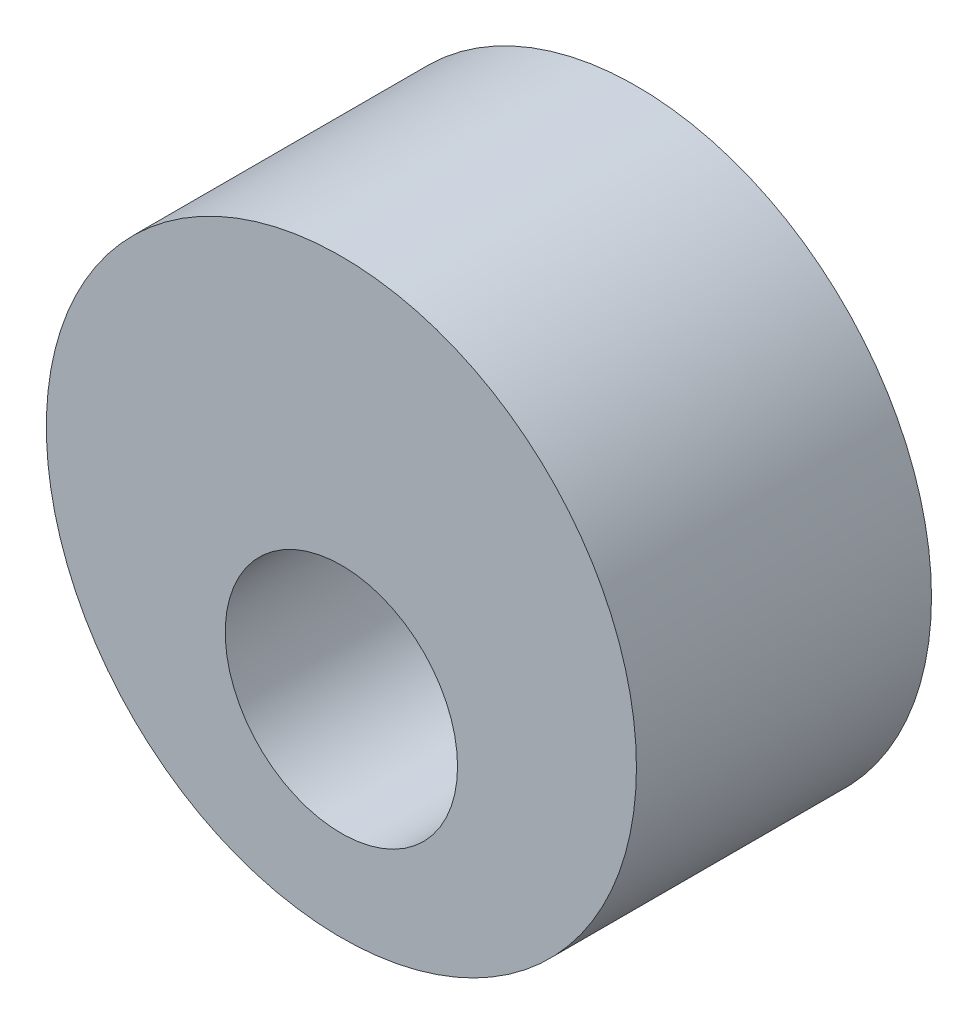
ISO-10303-21;
HEADER;
FILE_DESCRIPTION(('STEP AP214'),'2;1');
FILE_NAME('part.step','',(''),(''),'','','');
FILE_SCHEMA(('AUTOMOTIVE_DESIGN { 1 0 10303 214 1 1 1 1 }'));
ENDSEC;
DATA;
#1=APPLICATION_CONTEXT('core data for automotive mechanical design processes');
#2=APPLICATION_PROTOCOL_DEFINITION('international standard','automotive_design',2000,#1);
#3=PRODUCT_CONTEXT('',#1,'mechanical');
#4=PRODUCT('Part','Part','',(#3));
#5=PRODUCT_RELATED_PRODUCT_CATEGORY('part','',(#4));
#6=PRODUCT_DEFINITION_FORMATION('','',#4);
#7=PRODUCT_DEFINITION_CONTEXT('part definition',#1,'design');
#8=PRODUCT_DEFINITION('design','',#6,#7);
#9=PRODUCT_DEFINITION_SHAPE('','',#8);
#10=(LENGTH_UNIT() NAMED_UNIT(*) SI_UNIT(.MILLI.,.METRE.));
#11=(NAMED_UNIT(*) PLANE_ANGLE_UNIT() SI_UNIT($,.RADIAN.));
#12=(NAMED_UNIT(*) SI_UNIT($,.STERADIAN.) SOLID_ANGLE_UNIT());
#13=UNCERTAINTY_MEASURE_WITH_UNIT(LENGTH_MEASURE(1.E-05),#10,'distance_accuracy_value','');
#14=(GEOMETRIC_REPRESENTATION_CONTEXT(3) GLOBAL_UNCERTAINTY_ASSIGNED_CONTEXT((#13)) GLOBAL_UNIT_ASSIGNED_CONTEXT((#10,
#11,#12)) REPRESENTATION_CONTEXT('',''));
#15=CARTESIAN_POINT('',(0.,0.,0.));
#16=DIRECTION('',(0.,0.,1.));
#17=DIRECTION('',(1.,0.,0.));
#18=AXIS2_PLACEMENT_3D('',#15,#16,#17);
#19=CARTESIAN_POINT('',(0.,0.,6.35));
#20=DIRECTION('',(0.,0.,1.));
#21=DIRECTION('',(1.,0.,0.));
#22=AXIS2_PLACEMENT_3D('',#19,#20,#21);
#23=PLANE('',#22);
#24=CARTESIAN_POINT('',(0.,0.,6.35));
#25=DIRECTION('',(0.,0.,1.));
#26=DIRECTION('',(1.,0.,0.));
#27=AXIS2_PLACEMENT_3D('',#24,#25,#26);
#28=CIRCLE('',#27,6.35);
#29=CARTESIAN_POINT('',(6.35,0.,6.35));
#30=VERTEX_POINT('',#29);
#31=EDGE_CURVE('E10',#30,#30,#28,.T.);
#32=ORIENTED_EDGE('',*,*,#31,.T.);
#33=EDGE_LOOP('',(#32));
#34=FACE_BOUND('',#33,.T.);
#35=CARTESIAN_POINT('',(0.,-1.905,6.35));
#36=DIRECTION('',(0.,0.,1.));
#37=DIRECTION('',(1.,0.,0.));
#38=AXIS2_PLACEMENT_3D('',#35,#36,#37);
#39=CIRCLE('',#38,2.499995);
#40=CARTESIAN_POINT('',(2.499995,-1.905,6.35));
#41=VERTEX_POINT('',#40);
#42=EDGE_CURVE('E56',#41,#41,#39,.T.);
#43=ORIENTED_EDGE('',*,*,#42,.F.);
#44=EDGE_LOOP('',(#43));
#45=FACE_BOUND('',#44,.T.);
#46=ADVANCED_FACE('F43',(#34,#45),#23,.T.);
#47=CARTESIAN_POINT('',(0.,0.,0.));
#48=DIRECTION('',(0.,0.,1.));
#49=DIRECTION('',(1.,0.,0.));
#50=AXIS2_PLACEMENT_3D('',#47,#48,#49);
#51=PLANE('',#50);
#52=CARTESIAN_POINT('',(0.,0.,0.));
#53=DIRECTION('',(0.,0.,1.));
#54=DIRECTION('',(1.,0.,0.));
#55=AXIS2_PLACEMENT_3D('',#52,#53,#54);
#56=CIRCLE('',#55,6.35);
#57=CARTESIAN_POINT('',(6.35,0.,0.));
#58=VERTEX_POINT('',#57);
#59=EDGE_CURVE('E47',#58,#58,#56,.T.);
#60=ORIENTED_EDGE('',*,*,#59,.F.);
#61=EDGE_LOOP('',(#60));
#62=FACE_BOUND('',#61,.T.);
#63=CARTESIAN_POINT('',(0.,-1.905,0.));
#64=DIRECTION('',(0.,0.,1.));
#65=DIRECTION('',(1.,0.,0.));
#66=AXIS2_PLACEMENT_3D('',#63,#64,#65);
#67=CIRCLE('',#66,2.499995);
#68=CARTESIAN_POINT('',(2.499995,-1.905,0.));
#69=VERTEX_POINT('',#68);
#70=EDGE_CURVE('E58',#69,#69,#67,.T.);
#71=ORIENTED_EDGE('',*,*,#70,.T.);
#72=EDGE_LOOP('',(#71));
#73=FACE_BOUND('',#72,.T.);
#74=ADVANCED_FACE('F70',(#62,#73),#51,.F.);
#75=CARTESIAN_POINT('',(0.,0.,6.35));
#76=DIRECTION('',(0.,0.,-1.));
#77=DIRECTION('',(-1.,0.,0.));
#78=AXIS2_PLACEMENT_3D('',#75,#76,#77);
#79=CYLINDRICAL_SURFACE('',#78,6.35);
#80=ORIENTED_EDGE('',*,*,#31,.F.);
#81=EDGE_LOOP('',(#80));
#82=FACE_BOUND('',#81,.T.);
#83=ORIENTED_EDGE('',*,*,#59,.T.);
#84=EDGE_LOOP('',(#83));
#85=FACE_BOUND('',#84,.T.);
#86=ADVANCED_FACE('F45',(#82,#85),#79,.T.);
#87=CARTESIAN_POINT('',(0.,-1.905,6.35));
#88=DIRECTION('',(0.,0.,-1.));
#89=DIRECTION('',(-1.,0.,0.));
#90=AXIS2_PLACEMENT_3D('',#87,#88,#89);
#91=CYLINDRICAL_SURFACE('',#90,2.499995);
#92=ORIENTED_EDGE('',*,*,#42,.T.);
#93=EDGE_LOOP('',(#92));
#94=FACE_BOUND('',#93,.T.);
#95=ORIENTED_EDGE('',*,*,#70,.F.);
#96=EDGE_LOOP('',(#95));
#97=FACE_BOUND('',#96,.T.);
#98=ADVANCED_FACE('F66',(#94,#97),#91,.F.);
#99=CLOSED_SHELL('',(#46,#74,#86,#98));
#100=MANIFOLD_SOLID_BREP('B2',#99);
#101=ADVANCED_BREP_SHAPE_REPRESENTATION('',(#18,#100),#14);
#102=SHAPE_DEFINITION_REPRESENTATION(#9,#101);
ENDSEC;
END-ISO-10303-21;
